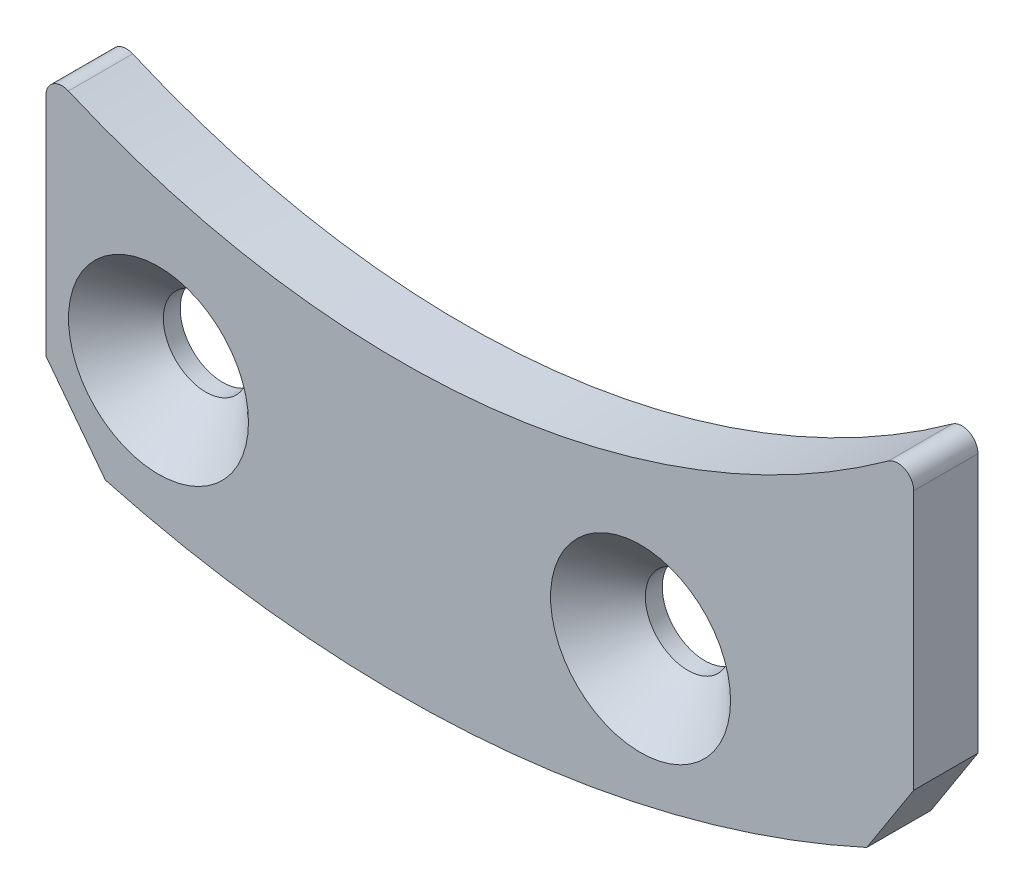
ISO-10303-21;
HEADER;
FILE_DESCRIPTION(('STEP AP214'),'2;1');
FILE_NAME('part.step','',(''),(''),'','','');
FILE_SCHEMA(('AUTOMOTIVE_DESIGN { 1 0 10303 214 1 1 1 1 }'));
ENDSEC;
DATA;
#1=APPLICATION_CONTEXT('core data for automotive mechanical design processes');
#2=APPLICATION_PROTOCOL_DEFINITION('international standard','automotive_design',2000,#1);
#3=PRODUCT_CONTEXT('',#1,'mechanical');
#4=PRODUCT('Part','Part','',(#3));
#5=PRODUCT_RELATED_PRODUCT_CATEGORY('part','',(#4));
#6=PRODUCT_DEFINITION_FORMATION('','',#4);
#7=PRODUCT_DEFINITION_CONTEXT('part definition',#1,'design');
#8=PRODUCT_DEFINITION('design','',#6,#7);
#9=PRODUCT_DEFINITION_SHAPE('','',#8);
#10=(LENGTH_UNIT() NAMED_UNIT(*) SI_UNIT(.MILLI.,.METRE.));
#11=(NAMED_UNIT(*) PLANE_ANGLE_UNIT() SI_UNIT($,.RADIAN.));
#12=(NAMED_UNIT(*) SI_UNIT($,.STERADIAN.) SOLID_ANGLE_UNIT());
#13=UNCERTAINTY_MEASURE_WITH_UNIT(LENGTH_MEASURE(1.E-05),#10,'distance_accuracy_value','');
#14=(GEOMETRIC_REPRESENTATION_CONTEXT(3) GLOBAL_UNCERTAINTY_ASSIGNED_CONTEXT((#13)) GLOBAL_UNIT_ASSIGNED_CONTEXT((#10,
#11,#12)) REPRESENTATION_CONTEXT('',''));
#15=CARTESIAN_POINT('',(0.,0.,0.));
#16=DIRECTION('',(0.,0.,1.));
#17=DIRECTION('',(1.,0.,0.));
#18=AXIS2_PLACEMENT_3D('',#15,#16,#17);
#19=CARTESIAN_POINT('',(15.,10.,-0.62));
#20=DIRECTION('',(0.,0.,-1.));
#21=DIRECTION('',(1.,0.,0.));
#22=AXIS2_PLACEMENT_3D('',#19,#20,#21);
#23=CYLINDRICAL_SURFACE('',#22,2.65);
#24=CARTESIAN_POINT('',(15.,10.,1.05));
#25=DIRECTION('',(0.,0.,-1.));
#26=DIRECTION('',(1.,0.,0.));
#27=AXIS2_PLACEMENT_3D('',#24,#25,#26);
#28=CIRCLE('',#27,2.65);
#29=CARTESIAN_POINT('',(12.35,10.,1.05));
#30=VERTEX_POINT('',#29);
#31=CARTESIAN_POINT('',(17.65,10.,1.05));
#32=VERTEX_POINT('',#31);
#33=EDGE_CURVE('E161',#30,#32,#28,.T.);
#34=ORIENTED_EDGE('',*,*,#33,.F.);
#35=DIRECTION('',(0.,0.,-1.));
#36=VECTOR('',#35,1.);
#37=CARTESIAN_POINT('',(12.35,10.,-0.62));
#38=LINE('',#37,#36);
#39=CARTESIAN_POINT('',(12.35,10.,0.));
#40=VERTEX_POINT('',#39);
#41=EDGE_CURVE('E11',#30,#40,#38,.T.);
#42=ORIENTED_EDGE('',*,*,#41,.T.);
#43=CARTESIAN_POINT('',(15.,10.,0.));
#44=DIRECTION('',(0.,0.,-1.));
#45=DIRECTION('',(1.,0.,0.));
#46=AXIS2_PLACEMENT_3D('',#43,#44,#45);
#47=CIRCLE('',#46,2.65);
#48=EDGE_CURVE('E151',#40,#40,#47,.T.);
#49=ORIENTED_EDGE('',*,*,#48,.T.);
#50=ORIENTED_EDGE('',*,*,#41,.F.);
#51=CARTESIAN_POINT('',(15.,10.,1.05));
#52=DIRECTION('',(0.,0.,-1.));
#53=DIRECTION('',(1.,0.,0.));
#54=AXIS2_PLACEMENT_3D('',#51,#52,#53);
#55=CIRCLE('',#54,2.65);
#56=EDGE_CURVE('E28',#32,#30,#55,.T.);
#57=ORIENTED_EDGE('',*,*,#56,.F.);
#58=EDGE_LOOP('',(#34,#42,#49,#50,#57));
#59=FACE_BOUND('',#58,.T.);
#60=ADVANCED_FACE('F17',(#59),#23,.F.);
#61=CARTESIAN_POINT('',(15.,10.,2.525));
#62=DIRECTION('',(0.,0.,1.));
#63=DIRECTION('',(-1.,0.,0.));
#64=AXIS2_PLACEMENT_3D('',#61,#62,#63);
#65=CONICAL_SURFACE('',#64,4.125,0.785398163397448);
#66=ORIENTED_EDGE('',*,*,#33,.T.);
#67=DIRECTION('',(0.707106781186548,0.,0.707106781186548));
#68=VECTOR('',#67,1.);
#69=CARTESIAN_POINT('',(19.125,10.,2.525));
#70=LINE('',#69,#68);
#71=CARTESIAN_POINT('',(20.6,10.,4.));
#72=VERTEX_POINT('',#71);
#73=EDGE_CURVE('E165',#32,#72,#70,.T.);
#74=ORIENTED_EDGE('',*,*,#73,.T.);
#75=CARTESIAN_POINT('',(15.,10.,4.));
#76=DIRECTION('',(0.,0.,-1.));
#77=DIRECTION('',(1.,0.,0.));
#78=AXIS2_PLACEMENT_3D('',#75,#76,#77);
#79=CIRCLE('',#78,5.6);
#80=EDGE_CURVE('E168',#72,#72,#79,.T.);
#81=ORIENTED_EDGE('',*,*,#80,.F.);
#82=ORIENTED_EDGE('',*,*,#73,.F.);
#83=ORIENTED_EDGE('',*,*,#56,.T.);
#84=EDGE_LOOP('',(#66,#74,#81,#82,#83));
#85=FACE_BOUND('',#84,.T.);
#86=ADVANCED_FACE('F290',(#85),#65,.F.);
#87=CARTESIAN_POINT('',(-15.,10.,-0.62));
#88=DIRECTION('',(0.,0.,1.));
#89=DIRECTION('',(-1.,0.,0.));
#90=AXIS2_PLACEMENT_3D('',#87,#88,#89);
#91=CYLINDRICAL_SURFACE('',#90,2.65);
#92=CARTESIAN_POINT('',(-15.,10.,0.));
#93=DIRECTION('',(0.,0.,1.));
#94=DIRECTION('',(-1.,0.,0.));
#95=AXIS2_PLACEMENT_3D('',#92,#93,#94);
#96=CIRCLE('',#95,2.65);
#97=CARTESIAN_POINT('',(-12.35,10.,0.));
#98=VERTEX_POINT('',#97);
#99=EDGE_CURVE('E183',#98,#98,#96,.T.);
#100=ORIENTED_EDGE('',*,*,#99,.F.);
#101=DIRECTION('',(0.,0.,1.));
#102=VECTOR('',#101,1.);
#103=CARTESIAN_POINT('',(-12.35,10.,-0.62));
#104=LINE('',#103,#102);
#105=CARTESIAN_POINT('',(-12.35,10.,1.05));
#106=VERTEX_POINT('',#105);
#107=EDGE_CURVE('E159',#98,#106,#104,.T.);
#108=ORIENTED_EDGE('',*,*,#107,.T.);
#109=CARTESIAN_POINT('',(-15.,10.,1.05));
#110=DIRECTION('',(0.,0.,1.));
#111=DIRECTION('',(-1.,0.,0.));
#112=AXIS2_PLACEMENT_3D('',#109,#110,#111);
#113=CIRCLE('',#112,2.65);
#114=EDGE_CURVE('E160',#106,#106,#113,.T.);
#115=ORIENTED_EDGE('',*,*,#114,.T.);
#116=ORIENTED_EDGE('',*,*,#107,.F.);
#117=EDGE_LOOP('',(#100,#108,#115,#116));
#118=FACE_BOUND('',#117,.T.);
#119=ADVANCED_FACE('F292',(#118),#91,.F.);
#120=CARTESIAN_POINT('',(-15.,10.,2.525));
#121=DIRECTION('',(0.,0.,1.));
#122=DIRECTION('',(-1.,0.,0.));
#123=AXIS2_PLACEMENT_3D('',#120,#121,#122);
#124=CONICAL_SURFACE('',#123,4.125,0.785398163397448);
#125=ORIENTED_EDGE('',*,*,#114,.F.);
#126=DIRECTION('',(0.707106781186548,0.,0.707106781186548));
#127=VECTOR('',#126,1.);
#128=CARTESIAN_POINT('',(-10.875,10.,2.525));
#129=LINE('',#128,#127);
#130=CARTESIAN_POINT('',(-9.4,10.,4.));
#131=VERTEX_POINT('',#130);
#132=EDGE_CURVE('E74',#106,#131,#129,.T.);
#133=ORIENTED_EDGE('',*,*,#132,.T.);
#134=CARTESIAN_POINT('',(-15.,10.,4.));
#135=DIRECTION('',(0.,0.,1.));
#136=DIRECTION('',(-1.,0.,0.));
#137=AXIS2_PLACEMENT_3D('',#134,#135,#136);
#138=CIRCLE('',#137,5.6);
#139=EDGE_CURVE('E143',#131,#131,#138,.T.);
#140=ORIENTED_EDGE('',*,*,#139,.T.);
#141=ORIENTED_EDGE('',*,*,#132,.F.);
#142=EDGE_LOOP('',(#125,#133,#140,#141));
#143=FACE_BOUND('',#142,.T.);
#144=ADVANCED_FACE('F299',(#143),#124,.F.);
#145=CARTESIAN_POINT('',(0.,0.,4.));
#146=DIRECTION('',(0.,0.,1.));
#147=DIRECTION('',(1.,0.,0.));
#148=AXIS2_PLACEMENT_3D('',#145,#146,#147);
#149=PLANE('',#148);
#150=ORIENTED_EDGE('',*,*,#80,.T.);
#151=EDGE_LOOP('',(#150));
#152=FACE_BOUND('',#151,.T.);
#153=ORIENTED_EDGE('',*,*,#139,.F.);
#154=EDGE_LOOP('',(#153));
#155=FACE_BOUND('',#154,.T.);
#156=DIRECTION('',(0.,1.,0.));
#157=VECTOR('',#156,1.);
#158=CARTESIAN_POINT('',(32.,10.87301800362,4.));
#159=LINE('',#158,#157);
#160=CARTESIAN_POINT('',(32.,10.87301800362,4.));
#161=VERTEX_POINT('',#160);
#162=CARTESIAN_POINT('',(32.,27.01162947959,4.));
#163=VERTEX_POINT('',#162);
#164=EDGE_CURVE('E150',#161,#163,#159,.T.);
#165=ORIENTED_EDGE('',*,*,#164,.T.);
#166=CARTESIAN_POINT('',(31.,27.01162947959,4.));
#167=DIRECTION('',(0.,0.,1.));
#168=DIRECTION('',(1.,0.,0.));
#169=AXIS2_PLACEMENT_3D('',#166,#167,#168);
#170=CIRCLE('',#169,1.);
#171=CARTESIAN_POINT('',(30.41509433962,27.82273081016,4.));
#172=VERTEX_POINT('',#171);
#173=EDGE_CURVE('E62',#163,#172,#170,.T.);
#174=ORIENTED_EDGE('',*,*,#173,.T.);
#175=CARTESIAN_POINT('',(0.,70.,4.));
#176=DIRECTION('',(0.,0.,-1.));
#177=DIRECTION('',(0.584905660377367,-0.811101330573755,0.));
#178=AXIS2_PLACEMENT_3D('',#175,#176,#177);
#179=CIRCLE('',#178,52.);
#180=CARTESIAN_POINT('',(-20.60377358491,22.25605259238,4.));
#181=VERTEX_POINT('',#180);
#182=EDGE_CURVE('E102',#172,#181,#179,.T.);
#183=ORIENTED_EDGE('',*,*,#182,.T.);
#184=CARTESIAN_POINT('',(-21.,21.33789975761,4.));
#185=DIRECTION('',(0.,0.,1.));
#186=DIRECTION('',(0.396226415094305,0.91815283476201,0.));
#187=AXIS2_PLACEMENT_3D('',#184,#185,#186);
#188=CIRCLE('',#187,1.);
#189=CARTESIAN_POINT('',(-22.,21.33789975761,4.));
#190=VERTEX_POINT('',#189);
#191=EDGE_CURVE('E98',#181,#190,#188,.T.);
#192=ORIENTED_EDGE('',*,*,#191,.T.);
#193=DIRECTION('',(0.,-1.,0.));
#194=VECTOR('',#193,1.);
#195=CARTESIAN_POINT('',(-22.,21.33789975761,4.));
#196=LINE('',#195,#194);
#197=CARTESIAN_POINT('',(-22.,7.262451434568,4.));
#198=VERTEX_POINT('',#197);
#199=EDGE_CURVE('E21',#190,#198,#196,.T.);
#200=ORIENTED_EDGE('',*,*,#199,.T.);
#201=DIRECTION('',(0.607643620250205,-0.794209815331707,0.));
#202=VECTOR('',#201,1.);
#203=CARTESIAN_POINT('',(-22.,7.262451434568,4.));
#204=LINE('',#203,#202);
#205=CARTESIAN_POINT('',(-18.30769230769,2.436486160303,4.));
#206=VERTEX_POINT('',#205);
#207=EDGE_CURVE('E129',#198,#206,#204,.T.);
#208=ORIENTED_EDGE('',*,*,#207,.T.);
#209=CARTESIAN_POINT('',(0.,70.,4.));
#210=DIRECTION('',(0.,0.,1.));
#211=DIRECTION('',(-0.261538461538499,-0.965193054852797,0.));
#212=AXIS2_PLACEMENT_3D('',#209,#210,#211);
#213=CIRCLE('',#212,70.);
#214=CARTESIAN_POINT('',(29.07692307692,6.324788619285,4.));
#215=VERTEX_POINT('',#214);
#216=EDGE_CURVE('E152',#206,#215,#213,.T.);
#217=ORIENTED_EDGE('',*,*,#216,.T.);
#218=DIRECTION('',(0.540654873563202,0.841244499353403,0.));
#219=VECTOR('',#218,1.);
#220=CARTESIAN_POINT('',(29.07692307692,6.324788619285,4.));
#221=LINE('',#220,#219);
#222=EDGE_CURVE('E221',#215,#161,#221,.T.);
#223=ORIENTED_EDGE('',*,*,#222,.T.);
#224=EDGE_LOOP('',(#165,#174,#183,#192,#200,#208,#217,#223));
#225=FACE_BOUND('',#224,.T.);
#226=ADVANCED_FACE('F100',(#152,#155,#225),#149,.T.);
#227=CARTESIAN_POINT('',(31.,27.01162947959,9.2144));
#228=DIRECTION('',(0.,0.,-1.));
#229=DIRECTION('',(-0.584905660377368,0.811101330573755,0.));
#230=AXIS2_PLACEMENT_3D('',#227,#228,#229);
#231=CYLINDRICAL_SURFACE('',#230,1.);
#232=CARTESIAN_POINT('',(31.,27.01162947959,0.));
#233=DIRECTION('',(0.,0.,-1.));
#234=DIRECTION('',(-0.584905660377368,0.811101330573755,0.));
#235=AXIS2_PLACEMENT_3D('',#232,#233,#234);
#236=CIRCLE('',#235,1.);
#237=CARTESIAN_POINT('',(30.41509433962,27.82273081016,0.));
#238=VERTEX_POINT('',#237);
#239=CARTESIAN_POINT('',(32.,27.01162947959,0.));
#240=VERTEX_POINT('',#239);
#241=EDGE_CURVE('E179',#238,#240,#236,.T.);
#242=ORIENTED_EDGE('',*,*,#241,.F.);
#243=DIRECTION('',(0.,0.,-1.));
#244=VECTOR('',#243,1.);
#245=CARTESIAN_POINT('',(30.41509433962,27.82273081016,4.));
#246=LINE('',#245,#244);
#247=EDGE_CURVE('E144',#172,#238,#246,.T.);
#248=ORIENTED_EDGE('',*,*,#247,.F.);
#249=ORIENTED_EDGE('',*,*,#173,.F.);
#250=DIRECTION('',(0.,0.,-1.));
#251=VECTOR('',#250,1.);
#252=CARTESIAN_POINT('',(32.,27.01162947959,4.));
#253=LINE('',#252,#251);
#254=EDGE_CURVE('E146',#163,#240,#253,.T.);
#255=ORIENTED_EDGE('',*,*,#254,.T.);
#256=EDGE_LOOP('',(#242,#248,#249,#255));
#257=FACE_BOUND('',#256,.T.);
#258=ADVANCED_FACE('F308',(#257),#231,.T.);
#259=CARTESIAN_POINT('',(0.,70.,0.));
#260=DIRECTION('',(0.,0.,1.));
#261=DIRECTION('',(1.,0.,0.));
#262=AXIS2_PLACEMENT_3D('',#259,#260,#261);
#263=CYLINDRICAL_SURFACE('',#262,52.);
#264=DIRECTION('',(0.,0.,-1.));
#265=VECTOR('',#264,1.);
#266=CARTESIAN_POINT('',(-20.60377358491,22.25605259238,4.));
#267=LINE('',#266,#265);
#268=CARTESIAN_POINT('',(-20.60377358491,22.25605259238,0.));
#269=VERTEX_POINT('',#268);
#270=EDGE_CURVE('E107',#181,#269,#267,.T.);
#271=ORIENTED_EDGE('',*,*,#270,.F.);
#272=ORIENTED_EDGE('',*,*,#182,.F.);
#273=ORIENTED_EDGE('',*,*,#247,.T.);
#274=CARTESIAN_POINT('',(0.,70.,0.));
#275=DIRECTION('',(0.,0.,-1.));
#276=DIRECTION('',(0.584905660377367,-0.811101330573755,0.));
#277=AXIS2_PLACEMENT_3D('',#274,#275,#276);
#278=CIRCLE('',#277,52.);
#279=EDGE_CURVE('E184',#238,#269,#278,.T.);
#280=ORIENTED_EDGE('',*,*,#279,.T.);
#281=EDGE_LOOP('',(#271,#272,#273,#280));
#282=FACE_BOUND('',#281,.T.);
#283=ADVANCED_FACE('F310',(#282),#263,.F.);
#284=CARTESIAN_POINT('',(-21.,21.33789975761,9.2144));
#285=DIRECTION('',(0.,0.,-1.));
#286=DIRECTION('',(-1.,0.,0.));
#287=AXIS2_PLACEMENT_3D('',#284,#285,#286);
#288=CYLINDRICAL_SURFACE('',#287,1.);
#289=CARTESIAN_POINT('',(-21.,21.33789975761,0.));
#290=DIRECTION('',(0.,0.,-1.));
#291=DIRECTION('',(-1.,0.,0.));
#292=AXIS2_PLACEMENT_3D('',#289,#290,#291);
#293=CIRCLE('',#292,1.);
#294=CARTESIAN_POINT('',(-22.,21.33789975761,0.));
#295=VERTEX_POINT('',#294);
#296=EDGE_CURVE('E115',#295,#269,#293,.T.);
#297=ORIENTED_EDGE('',*,*,#296,.F.);
#298=DIRECTION('',(0.,0.,-1.));
#299=VECTOR('',#298,1.);
#300=CARTESIAN_POINT('',(-22.,21.33789975761,4.));
#301=LINE('',#300,#299);
#302=EDGE_CURVE('E108',#190,#295,#301,.T.);
#303=ORIENTED_EDGE('',*,*,#302,.F.);
#304=ORIENTED_EDGE('',*,*,#191,.F.);
#305=ORIENTED_EDGE('',*,*,#270,.T.);
#306=EDGE_LOOP('',(#297,#303,#304,#305));
#307=FACE_BOUND('',#306,.T.);
#308=ADVANCED_FACE('F112',(#307),#288,.T.);
#309=CARTESIAN_POINT('',(-22.,22.88312404244,0.));
#310=DIRECTION('',(-1.,0.,0.));
#311=DIRECTION('',(0.,0.,1.));
#312=AXIS2_PLACEMENT_3D('',#309,#310,#311);
#313=PLANE('',#312);
#314=DIRECTION('',(0.,-1.,0.));
#315=VECTOR('',#314,1.);
#316=CARTESIAN_POINT('',(-22.,21.33789975761,0.));
#317=LINE('',#316,#315);
#318=CARTESIAN_POINT('',(-22.,7.262451434568,0.));
#319=VERTEX_POINT('',#318);
#320=EDGE_CURVE('E172',#295,#319,#317,.T.);
#321=ORIENTED_EDGE('',*,*,#320,.T.);
#322=DIRECTION('',(0.,0.,-1.));
#323=VECTOR('',#322,1.);
#324=CARTESIAN_POINT('',(-22.,7.262451434568,4.));
#325=LINE('',#324,#323);
#326=EDGE_CURVE('E122',#198,#319,#325,.T.);
#327=ORIENTED_EDGE('',*,*,#326,.F.);
#328=ORIENTED_EDGE('',*,*,#199,.F.);
#329=ORIENTED_EDGE('',*,*,#302,.T.);
#330=EDGE_LOOP('',(#321,#327,#328,#329));
#331=FACE_BOUND('',#330,.T.);
#332=ADVANCED_FACE('F120',(#331),#313,.T.);
#333=CARTESIAN_POINT('',(-20.15384615385,4.849468797435,2.));
#334=DIRECTION('',(-0.794209815331707,-0.607643620250205,0.));
#335=DIRECTION('',(-0.607643620250205,0.794209815331707,0.));
#336=AXIS2_PLACEMENT_3D('',#333,#334,#335);
#337=PLANE('',#336);
#338=DIRECTION('',(-0.607643620250205,0.794209815331707,0.));
#339=VECTOR('',#338,1.);
#340=CARTESIAN_POINT('',(-18.30769230769,2.436486160303,0.));
#341=LINE('',#340,#339);
#342=CARTESIAN_POINT('',(-18.30769230769,2.436486160303,0.));
#343=VERTEX_POINT('',#342);
#344=EDGE_CURVE('E175',#343,#319,#341,.T.);
#345=ORIENTED_EDGE('',*,*,#344,.F.);
#346=DIRECTION('',(0.,0.,-1.));
#347=VECTOR('',#346,1.);
#348=CARTESIAN_POINT('',(-18.30769230769,2.436486160303,4.));
#349=LINE('',#348,#347);
#350=EDGE_CURVE('E137',#206,#343,#349,.T.);
#351=ORIENTED_EDGE('',*,*,#350,.F.);
#352=ORIENTED_EDGE('',*,*,#207,.F.);
#353=ORIENTED_EDGE('',*,*,#326,.T.);
#354=EDGE_LOOP('',(#345,#351,#352,#353));
#355=FACE_BOUND('',#354,.T.);
#356=ADVANCED_FACE('F307',(#355),#337,.T.);
#357=CARTESIAN_POINT('',(0.,70.,0.));
#358=DIRECTION('',(0.,0.,1.));
#359=DIRECTION('',(1.,0.,0.));
#360=AXIS2_PLACEMENT_3D('',#357,#358,#359);
#361=CYLINDRICAL_SURFACE('',#360,70.);
#362=DIRECTION('',(0.,0.,-1.));
#363=VECTOR('',#362,1.);
#364=CARTESIAN_POINT('',(29.07692307692,6.324788619285,4.));
#365=LINE('',#364,#363);
#366=CARTESIAN_POINT('',(29.07692307692,6.324788619285,0.));
#367=VERTEX_POINT('',#366);
#368=EDGE_CURVE('E156',#215,#367,#365,.T.);
#369=ORIENTED_EDGE('',*,*,#368,.F.);
#370=ORIENTED_EDGE('',*,*,#216,.F.);
#371=ORIENTED_EDGE('',*,*,#350,.T.);
#372=CARTESIAN_POINT('',(0.,70.,0.));
#373=DIRECTION('',(0.,0.,1.));
#374=DIRECTION('',(-0.261538461538499,-0.965193054852797,0.));
#375=AXIS2_PLACEMENT_3D('',#372,#373,#374);
#376=CIRCLE('',#375,70.);
#377=EDGE_CURVE('E193',#343,#367,#376,.T.);
#378=ORIENTED_EDGE('',*,*,#377,.T.);
#379=EDGE_LOOP('',(#369,#370,#371,#378));
#380=FACE_BOUND('',#379,.T.);
#381=ADVANCED_FACE('F305',(#380),#361,.T.);
#382=CARTESIAN_POINT('',(30.53846153846,8.598903311454,2.));
#383=DIRECTION('',(0.841244499353403,-0.540654873563202,0.));
#384=DIRECTION('',(0.,0.,-1.));
#385=AXIS2_PLACEMENT_3D('',#382,#383,#384);
#386=PLANE('',#385);
#387=DIRECTION('',(-0.540654873563202,-0.841244499353403,0.));
#388=VECTOR('',#387,1.);
#389=CARTESIAN_POINT('',(32.,10.87301800362,0.));
#390=LINE('',#389,#388);
#391=CARTESIAN_POINT('',(32.,10.87301800362,0.));
#392=VERTEX_POINT('',#391);
#393=EDGE_CURVE('E192',#392,#367,#390,.T.);
#394=ORIENTED_EDGE('',*,*,#393,.F.);
#395=DIRECTION('',(0.,0.,-1.));
#396=VECTOR('',#395,1.);
#397=CARTESIAN_POINT('',(32.,10.87301800362,4.));
#398=LINE('',#397,#396);
#399=EDGE_CURVE('E178',#161,#392,#398,.T.);
#400=ORIENTED_EDGE('',*,*,#399,.F.);
#401=ORIENTED_EDGE('',*,*,#222,.F.);
#402=ORIENTED_EDGE('',*,*,#368,.T.);
#403=EDGE_LOOP('',(#394,#400,#401,#402));
#404=FACE_BOUND('',#403,.T.);
#405=ADVANCED_FACE('F19',(#404),#386,.T.);
#406=CARTESIAN_POINT('',(32.,7.742470334906,0.));
#407=DIRECTION('',(1.,0.,0.));
#408=DIRECTION('',(0.,1.,0.));
#409=AXIS2_PLACEMENT_3D('',#406,#407,#408);
#410=PLANE('',#409);
#411=DIRECTION('',(0.,1.,0.));
#412=VECTOR('',#411,1.);
#413=CARTESIAN_POINT('',(32.,10.87301800362,0.));
#414=LINE('',#413,#412);
#415=EDGE_CURVE('E188',#392,#240,#414,.T.);
#416=ORIENTED_EDGE('',*,*,#415,.T.);
#417=ORIENTED_EDGE('',*,*,#254,.F.);
#418=ORIENTED_EDGE('',*,*,#164,.F.);
#419=ORIENTED_EDGE('',*,*,#399,.T.);
#420=EDGE_LOOP('',(#416,#417,#418,#419));
#421=FACE_BOUND('',#420,.T.);
#422=ADVANCED_FACE('F238',(#421),#410,.T.);
#423=CARTESIAN_POINT('',(0.,0.,0.));
#424=DIRECTION('',(0.,0.,1.));
#425=DIRECTION('',(1.,0.,0.));
#426=AXIS2_PLACEMENT_3D('',#423,#424,#425);
#427=PLANE('',#426);
#428=ORIENTED_EDGE('',*,*,#48,.F.);
#429=EDGE_LOOP('',(#428));
#430=FACE_BOUND('',#429,.T.);
#431=ORIENTED_EDGE('',*,*,#99,.T.);
#432=EDGE_LOOP('',(#431));
#433=FACE_BOUND('',#432,.T.);
#434=ORIENTED_EDGE('',*,*,#415,.F.);
#435=ORIENTED_EDGE('',*,*,#393,.T.);
#436=ORIENTED_EDGE('',*,*,#377,.F.);
#437=ORIENTED_EDGE('',*,*,#344,.T.);
#438=ORIENTED_EDGE('',*,*,#320,.F.);
#439=ORIENTED_EDGE('',*,*,#296,.T.);
#440=ORIENTED_EDGE('',*,*,#279,.F.);
#441=ORIENTED_EDGE('',*,*,#241,.T.);
#442=EDGE_LOOP('',(#434,#435,#436,#437,#438,#439,#440,#441));
#443=FACE_BOUND('',#442,.T.);
#444=ADVANCED_FACE('F235',(#430,#433,#443),#427,.F.);
#445=CLOSED_SHELL('',(#60,#86,#119,#144,#226,#258,#283,#308,#332,#356,#381,#405,#422,#444));
#446=MANIFOLD_SOLID_BREP('B1',#445);
#447=ADVANCED_BREP_SHAPE_REPRESENTATION('',(#18,#446),#14);
#448=SHAPE_DEFINITION_REPRESENTATION(#9,#447);
ENDSEC;
END-ISO-10303-21;
